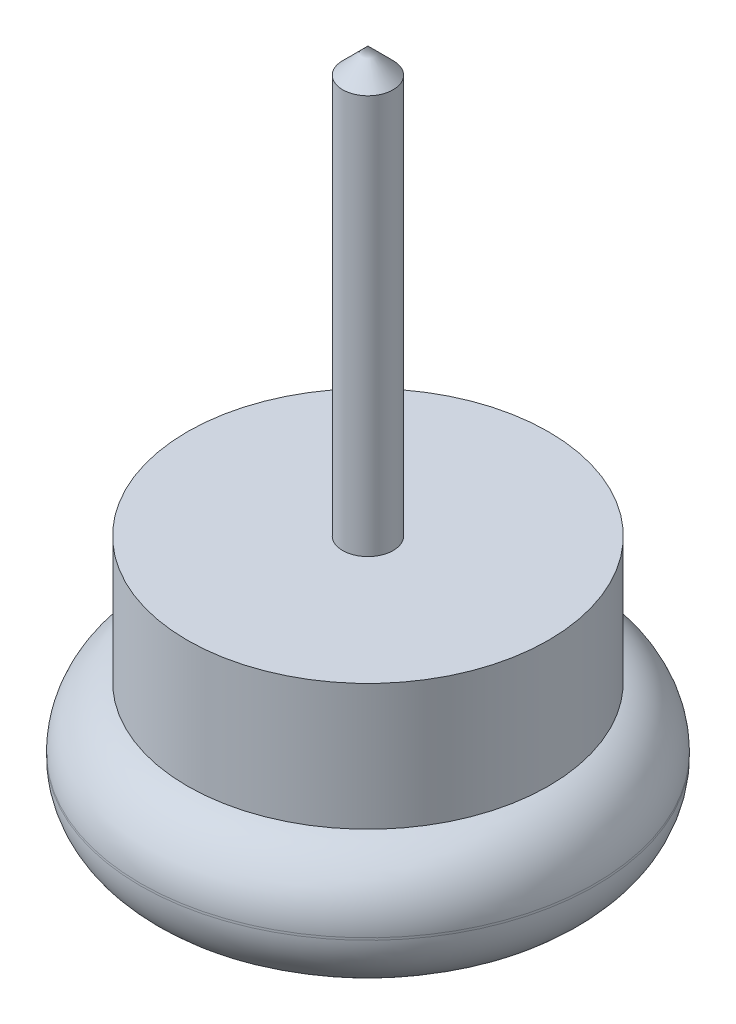
ISO-10303-21;
HEADER;
FILE_DESCRIPTION(('STEP AP214'),'2;1');
FILE_NAME('part.step','',(''),(''),'','','');
FILE_SCHEMA(('AUTOMOTIVE_DESIGN { 1 0 10303 214 1 1 1 1 }'));
ENDSEC;
DATA;
#1=APPLICATION_CONTEXT('core data for automotive mechanical design processes');
#2=APPLICATION_PROTOCOL_DEFINITION('international standard','automotive_design',2000,#1);
#3=PRODUCT_CONTEXT('',#1,'mechanical');
#4=PRODUCT('Part','Part','',(#3));
#5=PRODUCT_RELATED_PRODUCT_CATEGORY('part','',(#4));
#6=PRODUCT_DEFINITION_FORMATION('','',#4);
#7=PRODUCT_DEFINITION_CONTEXT('part definition',#1,'design');
#8=PRODUCT_DEFINITION('design','',#6,#7);
#9=PRODUCT_DEFINITION_SHAPE('','',#8);
#10=(LENGTH_UNIT() NAMED_UNIT(*) SI_UNIT(.MILLI.,.METRE.));
#11=(NAMED_UNIT(*) PLANE_ANGLE_UNIT() SI_UNIT($,.RADIAN.));
#12=(NAMED_UNIT(*) SI_UNIT($,.STERADIAN.) SOLID_ANGLE_UNIT());
#13=UNCERTAINTY_MEASURE_WITH_UNIT(LENGTH_MEASURE(1.E-05),#10,'distance_accuracy_value','');
#14=(GEOMETRIC_REPRESENTATION_CONTEXT(3) GLOBAL_UNCERTAINTY_ASSIGNED_CONTEXT((#13)) GLOBAL_UNIT_ASSIGNED_CONTEXT((#10,
#11,#12)) REPRESENTATION_CONTEXT('',''));
#15=CARTESIAN_POINT('',(0.,0.,0.));
#16=DIRECTION('',(0.,0.,1.));
#17=DIRECTION('',(1.,0.,0.));
#18=AXIS2_PLACEMENT_3D('',#15,#16,#17);
#19=CARTESIAN_POINT('',(0.,5.,0.));
#20=DIRECTION('',(0.,-1.,0.));
#21=DIRECTION('',(0.,0.,-1.));
#22=AXIS2_PLACEMENT_3D('',#19,#20,#21);
#23=CYLINDRICAL_SURFACE('',#22,9.);
#24=CARTESIAN_POINT('',(0.,2.58597845908534,0.));
#25=DIRECTION('',(0.,1.,0.));
#26=DIRECTION('',(0.,0.,1.));
#27=AXIS2_PLACEMENT_3D('',#24,#25,#26);
#28=CIRCLE('',#27,9.);
#29=CARTESIAN_POINT('',(0.,2.58597845908534,9.));
#30=VERTEX_POINT('',#29);
#31=EDGE_CURVE('E87',#30,#30,#28,.F.);
#32=ORIENTED_EDGE('',*,*,#31,.T.);
#33=EDGE_LOOP('',(#32));
#34=FACE_BOUND('',#33,.T.);
#35=CARTESIAN_POINT('',(0.,2.5,0.));
#36=DIRECTION('',(0.,1.,0.));
#37=DIRECTION('',(0.,0.,1.));
#38=AXIS2_PLACEMENT_3D('',#35,#36,#37);
#39=CIRCLE('',#38,9.);
#40=CARTESIAN_POINT('',(0.,2.5,9.));
#41=VERTEX_POINT('',#40);
#42=EDGE_CURVE('E92',#41,#41,#39,.T.);
#43=ORIENTED_EDGE('',*,*,#42,.T.);
#44=EDGE_LOOP('',(#43));
#45=FACE_BOUND('',#44,.T.);
#46=ADVANCED_FACE('F42',(#34,#45),#23,.T.);
#47=CARTESIAN_POINT('',(0.,0.,0.));
#48=DIRECTION('',(0.,1.,0.));
#49=DIRECTION('',(0.,0.,1.));
#50=AXIS2_PLACEMENT_3D('',#47,#48,#49);
#51=PLANE('',#50);
#52=CARTESIAN_POINT('',(0.,0.,0.));
#53=DIRECTION('',(0.,1.,0.));
#54=DIRECTION('',(0.,0.,1.));
#55=AXIS2_PLACEMENT_3D('',#52,#53,#54);
#56=CIRCLE('',#55,6.5);
#57=CARTESIAN_POINT('',(0.,0.,6.5));
#58=VERTEX_POINT('',#57);
#59=EDGE_CURVE('E50',#58,#58,#56,.F.);
#60=ORIENTED_EDGE('',*,*,#59,.T.);
#61=EDGE_LOOP('',(#60));
#62=FACE_BOUND('',#61,.T.);
#63=ADVANCED_FACE('F63',(#62),#51,.F.);
#64=CARTESIAN_POINT('',(0.,10.,0.));
#65=DIRECTION('',(0.,-1.,0.));
#66=DIRECTION('',(0.,0.,-1.));
#67=AXIS2_PLACEMENT_3D('',#64,#65,#66);
#68=CYLINDRICAL_SURFACE('',#67,7.15);
#69=CARTESIAN_POINT('',(0.,10.,0.));
#70=DIRECTION('',(0.,1.,0.));
#71=DIRECTION('',(0.,0.,1.));
#72=AXIS2_PLACEMENT_3D('',#69,#70,#71);
#73=CIRCLE('',#72,7.15);
#74=CARTESIAN_POINT('',(0.,10.,7.15));
#75=VERTEX_POINT('',#74);
#76=EDGE_CURVE('E93',#75,#75,#73,.T.);
#77=ORIENTED_EDGE('',*,*,#76,.F.);
#78=EDGE_LOOP('',(#77));
#79=FACE_BOUND('',#78,.T.);
#80=CARTESIAN_POINT('',(0.,5.,0.));
#81=DIRECTION('',(0.,1.,0.));
#82=DIRECTION('',(0.,0.,1.));
#83=AXIS2_PLACEMENT_3D('',#80,#81,#82);
#84=CIRCLE('',#83,7.15);
#85=CARTESIAN_POINT('',(0.,5.,7.15));
#86=VERTEX_POINT('',#85);
#87=EDGE_CURVE('E90',#86,#86,#84,.T.);
#88=ORIENTED_EDGE('',*,*,#87,.T.);
#89=EDGE_LOOP('',(#88));
#90=FACE_BOUND('',#89,.T.);
#91=ADVANCED_FACE('F69',(#79,#90),#68,.T.);
#92=CARTESIAN_POINT('',(0.,10.,0.));
#93=DIRECTION('',(0.,1.,0.));
#94=DIRECTION('',(0.,0.,1.));
#95=AXIS2_PLACEMENT_3D('',#92,#93,#94);
#96=PLANE('',#95);
#97=CARTESIAN_POINT('',(0.,10.,0.));
#98=DIRECTION('',(0.,1.,0.));
#99=DIRECTION('',(0.,0.,1.));
#100=AXIS2_PLACEMENT_3D('',#97,#98,#99);
#101=CIRCLE('',#100,1.);
#102=CARTESIAN_POINT('',(0.,10.,1.));
#103=VERTEX_POINT('',#102);
#104=EDGE_CURVE('E98',#103,#103,#101,.T.);
#105=ORIENTED_EDGE('',*,*,#104,.F.);
#106=EDGE_LOOP('',(#105));
#107=FACE_BOUND('',#106,.T.);
#108=ORIENTED_EDGE('',*,*,#76,.T.);
#109=EDGE_LOOP('',(#108));
#110=FACE_BOUND('',#109,.T.);
#111=ADVANCED_FACE('F82',(#107,#110),#96,.T.);
#112=CARTESIAN_POINT('',(0.,26.8,0.));
#113=DIRECTION('',(0.,-1.,0.));
#114=DIRECTION('',(0.,0.,-1.));
#115=AXIS2_PLACEMENT_3D('',#112,#113,#114);
#116=CYLINDRICAL_SURFACE('',#115,1.);
#117=CARTESIAN_POINT('',(0.,25.8,0.));
#118=DIRECTION('',(0.,1.,0.));
#119=DIRECTION('',(0.,0.,1.));
#120=AXIS2_PLACEMENT_3D('',#117,#118,#119);
#121=CIRCLE('',#120,1.);
#122=CARTESIAN_POINT('',(0.,25.8,1.));
#123=VERTEX_POINT('',#122);
#124=EDGE_CURVE('E11',#123,#123,#121,.F.);
#125=ORIENTED_EDGE('',*,*,#124,.T.);
#126=EDGE_LOOP('',(#125));
#127=FACE_BOUND('',#126,.T.);
#128=ORIENTED_EDGE('',*,*,#104,.T.);
#129=EDGE_LOOP('',(#128));
#130=FACE_BOUND('',#129,.T.);
#131=ADVANCED_FACE('F77',(#127,#130),#116,.T.);
#132=CARTESIAN_POINT('',(0.,2.58597845908534,0.));
#133=DIRECTION('',(0.,1.,0.));
#134=DIRECTION('',(0.,0.,1.));
#135=AXIS2_PLACEMENT_3D('',#132,#133,#134);
#136=TOROIDAL_SURFACE('',#135,6.5,2.5);
#137=ORIENTED_EDGE('',*,*,#31,.F.);
#138=EDGE_LOOP('',(#137));
#139=FACE_BOUND('',#138,.T.);
#140=ORIENTED_EDGE('',*,*,#87,.F.);
#141=EDGE_LOOP('',(#140));
#142=FACE_BOUND('',#141,.T.);
#143=ADVANCED_FACE('F59',(#139,#142),#136,.T.);
#144=CARTESIAN_POINT('',(0.,2.5,0.));
#145=DIRECTION('',(0.,1.,0.));
#146=DIRECTION('',(0.,0.,1.));
#147=AXIS2_PLACEMENT_3D('',#144,#145,#146);
#148=TOROIDAL_SURFACE('',#147,6.5,2.5);
#149=ORIENTED_EDGE('',*,*,#59,.F.);
#150=EDGE_LOOP('',(#149));
#151=FACE_BOUND('',#150,.T.);
#152=ORIENTED_EDGE('',*,*,#42,.F.);
#153=EDGE_LOOP('',(#152));
#154=FACE_BOUND('',#153,.T.);
#155=ADVANCED_FACE('F54',(#151,#154),#148,.T.);
#156=CARTESIAN_POINT('',(0.,25.8,0.));
#157=DIRECTION('',(0.,-1.,0.));
#158=DIRECTION('',(0.,0.,-1.));
#159=AXIS2_PLACEMENT_3D('',#156,#157,#158);
#160=CONICAL_SURFACE('',#159,1.00000000000001,0.785398163397446);
#161=ORIENTED_EDGE('',*,*,#124,.F.);
#162=EDGE_LOOP('',(#161));
#163=FACE_BOUND('',#162,.T.);
#164=CARTESIAN_POINT('',(0.,26.8,0.));
#165=VERTEX_POINT('',#164);
#166=VERTEX_LOOP('',#165);
#167=FACE_BOUND('',#166,.T.);
#168=ADVANCED_FACE('F45',(#163,#167),#160,.T.);
#169=CLOSED_SHELL('',(#46,#63,#91,#111,#131,#143,#155,#168));
#170=MANIFOLD_SOLID_BREP('B2',#169);
#171=ADVANCED_BREP_SHAPE_REPRESENTATION('',(#18,#170),#14);
#172=SHAPE_DEFINITION_REPRESENTATION(#9,#171);
ENDSEC;
END-ISO-10303-21;
